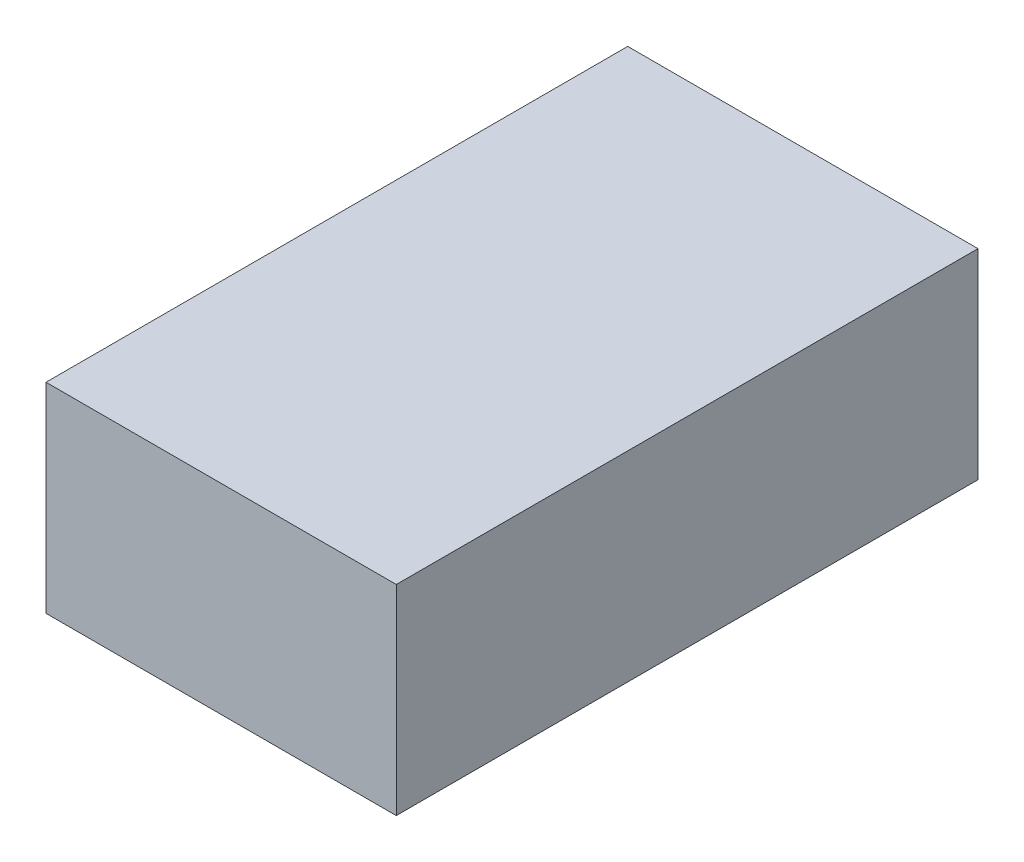
ISO-10303-21;
HEADER;
FILE_DESCRIPTION(('STEP AP214'),'2;1');
FILE_NAME('part.step','',(''),(''),'','','');
FILE_SCHEMA(('AUTOMOTIVE_DESIGN { 1 0 10303 214 1 1 1 1 }'));
ENDSEC;
DATA;
#1=APPLICATION_CONTEXT('core data for automotive mechanical design processes');
#2=APPLICATION_PROTOCOL_DEFINITION('international standard','automotive_design',2000,#1);
#3=PRODUCT_CONTEXT('',#1,'mechanical');
#4=PRODUCT('Part','Part','',(#3));
#5=PRODUCT_RELATED_PRODUCT_CATEGORY('part','',(#4));
#6=PRODUCT_DEFINITION_FORMATION('','',#4);
#7=PRODUCT_DEFINITION_CONTEXT('part definition',#1,'design');
#8=PRODUCT_DEFINITION('design','',#6,#7);
#9=PRODUCT_DEFINITION_SHAPE('','',#8);
#10=(LENGTH_UNIT() NAMED_UNIT(*) SI_UNIT(.MILLI.,.METRE.));
#11=(NAMED_UNIT(*) PLANE_ANGLE_UNIT() SI_UNIT($,.RADIAN.));
#12=(NAMED_UNIT(*) SI_UNIT($,.STERADIAN.) SOLID_ANGLE_UNIT());
#13=UNCERTAINTY_MEASURE_WITH_UNIT(LENGTH_MEASURE(1.E-05),#10,'distance_accuracy_value','');
#14=(GEOMETRIC_REPRESENTATION_CONTEXT(3) GLOBAL_UNCERTAINTY_ASSIGNED_CONTEXT((#13)) GLOBAL_UNIT_ASSIGNED_CONTEXT((#10,
#11,#12)) REPRESENTATION_CONTEXT('',''));
#15=CARTESIAN_POINT('',(0.,0.,0.));
#16=DIRECTION('',(0.,0.,1.));
#17=DIRECTION('',(1.,0.,0.));
#18=AXIS2_PLACEMENT_3D('',#15,#16,#17);
#19=CARTESIAN_POINT('',(-66.,78.,193.));
#20=DIRECTION('',(1.,0.,0.));
#21=DIRECTION('',(0.,0.,-1.));
#22=AXIS2_PLACEMENT_3D('',#19,#20,#21);
#23=PLANE('',#22);
#24=DIRECTION('',(0.,-1.,0.));
#25=VECTOR('',#24,1.);
#26=CARTESIAN_POINT('',(-66.,78.,100.));
#27=LINE('',#26,#25);
#28=CARTESIAN_POINT('',(-66.,78.,100.));
#29=VERTEX_POINT('',#28);
#30=CARTESIAN_POINT('',(-66.,46.,100.));
#31=VERTEX_POINT('',#30);
#32=EDGE_CURVE('E105',#29,#31,#27,.T.);
#33=ORIENTED_EDGE('',*,*,#32,.T.);
#34=DIRECTION('',(0.,0.,-1.));
#35=VECTOR('',#34,1.);
#36=CARTESIAN_POINT('',(-66.,46.,193.));
#37=LINE('',#36,#35);
#38=CARTESIAN_POINT('',(-66.,46.,193.));
#39=VERTEX_POINT('',#38);
#40=EDGE_CURVE('E11',#39,#31,#37,.T.);
#41=ORIENTED_EDGE('',*,*,#40,.F.);
#42=DIRECTION('',(0.,-1.,0.));
#43=VECTOR('',#42,1.);
#44=CARTESIAN_POINT('',(-66.,78.,193.));
#45=LINE('',#44,#43);
#46=CARTESIAN_POINT('',(-66.,78.,193.));
#47=VERTEX_POINT('',#46);
#48=EDGE_CURVE('E89',#47,#39,#45,.T.);
#49=ORIENTED_EDGE('',*,*,#48,.F.);
#50=DIRECTION('',(0.,0.,-1.));
#51=VECTOR('',#50,1.);
#52=CARTESIAN_POINT('',(-66.,78.,193.));
#53=LINE('',#52,#51);
#54=EDGE_CURVE('E97',#47,#29,#53,.T.);
#55=ORIENTED_EDGE('',*,*,#54,.T.);
#56=EDGE_LOOP('',(#33,#41,#49,#55));
#57=FACE_BOUND('',#56,.T.);
#58=ADVANCED_FACE('F39',(#57),#23,.F.);
#59=CARTESIAN_POINT('',(-66.,46.,193.));
#60=DIRECTION('',(0.,1.,0.));
#61=DIRECTION('',(0.,0.,1.));
#62=AXIS2_PLACEMENT_3D('',#59,#60,#61);
#63=PLANE('',#62);
#64=DIRECTION('',(1.,0.,0.));
#65=VECTOR('',#64,1.);
#66=CARTESIAN_POINT('',(-66.,46.,100.));
#67=LINE('',#66,#65);
#68=CARTESIAN_POINT('',(-10.,46.,100.));
#69=VERTEX_POINT('',#68);
#70=EDGE_CURVE('E92',#31,#69,#67,.T.);
#71=ORIENTED_EDGE('',*,*,#70,.T.);
#72=DIRECTION('',(0.,0.,-1.));
#73=VECTOR('',#72,1.);
#74=CARTESIAN_POINT('',(-10.,46.,193.));
#75=LINE('',#74,#73);
#76=CARTESIAN_POINT('',(-10.,46.,193.));
#77=VERTEX_POINT('',#76);
#78=EDGE_CURVE('E50',#77,#69,#75,.T.);
#79=ORIENTED_EDGE('',*,*,#78,.F.);
#80=DIRECTION('',(1.,0.,0.));
#81=VECTOR('',#80,1.);
#82=CARTESIAN_POINT('',(-66.,46.,193.));
#83=LINE('',#82,#81);
#84=EDGE_CURVE('E82',#39,#77,#83,.T.);
#85=ORIENTED_EDGE('',*,*,#84,.F.);
#86=ORIENTED_EDGE('',*,*,#40,.T.);
#87=EDGE_LOOP('',(#71,#79,#85,#86));
#88=FACE_BOUND('',#87,.T.);
#89=ADVANCED_FACE('F93',(#88),#63,.F.);
#90=CARTESIAN_POINT('',(-10.,46.,193.));
#91=DIRECTION('',(-1.,0.,0.));
#92=DIRECTION('',(0.,0.,1.));
#93=AXIS2_PLACEMENT_3D('',#90,#91,#92);
#94=PLANE('',#93);
#95=DIRECTION('',(0.,1.,0.));
#96=VECTOR('',#95,1.);
#97=CARTESIAN_POINT('',(-10.,46.,100.));
#98=LINE('',#97,#96);
#99=CARTESIAN_POINT('',(-10.,78.,100.));
#100=VERTEX_POINT('',#99);
#101=EDGE_CURVE('E74',#69,#100,#98,.T.);
#102=ORIENTED_EDGE('',*,*,#101,.T.);
#103=DIRECTION('',(0.,0.,-1.));
#104=VECTOR('',#103,1.);
#105=CARTESIAN_POINT('',(-10.,78.,193.));
#106=LINE('',#105,#104);
#107=CARTESIAN_POINT('',(-10.,78.,193.));
#108=VERTEX_POINT('',#107);
#109=EDGE_CURVE('E94',#108,#100,#106,.T.);
#110=ORIENTED_EDGE('',*,*,#109,.F.);
#111=DIRECTION('',(0.,1.,0.));
#112=VECTOR('',#111,1.);
#113=CARTESIAN_POINT('',(-10.,46.,193.));
#114=LINE('',#113,#112);
#115=EDGE_CURVE('E88',#77,#108,#114,.T.);
#116=ORIENTED_EDGE('',*,*,#115,.F.);
#117=ORIENTED_EDGE('',*,*,#78,.T.);
#118=EDGE_LOOP('',(#102,#110,#116,#117));
#119=FACE_BOUND('',#118,.T.);
#120=ADVANCED_FACE('F96',(#119),#94,.F.);
#121=CARTESIAN_POINT('',(-10.,78.,193.));
#122=DIRECTION('',(0.,-1.,0.));
#123=DIRECTION('',(0.,0.,-1.));
#124=AXIS2_PLACEMENT_3D('',#121,#122,#123);
#125=PLANE('',#124);
#126=DIRECTION('',(-1.,0.,0.));
#127=VECTOR('',#126,1.);
#128=CARTESIAN_POINT('',(-10.,78.,100.));
#129=LINE('',#128,#127);
#130=EDGE_CURVE('E76',#100,#29,#129,.T.);
#131=ORIENTED_EDGE('',*,*,#130,.T.);
#132=ORIENTED_EDGE('',*,*,#54,.F.);
#133=DIRECTION('',(-1.,0.,0.));
#134=VECTOR('',#133,1.);
#135=CARTESIAN_POINT('',(-10.,78.,193.));
#136=LINE('',#135,#134);
#137=EDGE_CURVE('E54',#108,#47,#136,.T.);
#138=ORIENTED_EDGE('',*,*,#137,.F.);
#139=ORIENTED_EDGE('',*,*,#109,.T.);
#140=EDGE_LOOP('',(#131,#132,#138,#139));
#141=FACE_BOUND('',#140,.T.);
#142=ADVANCED_FACE('F106',(#141),#125,.F.);
#143=CARTESIAN_POINT('',(0.,0.,193.));
#144=DIRECTION('',(0.,0.,1.));
#145=DIRECTION('',(1.,0.,0.));
#146=AXIS2_PLACEMENT_3D('',#143,#144,#145);
#147=PLANE('',#146);
#148=ORIENTED_EDGE('',*,*,#48,.T.);
#149=ORIENTED_EDGE('',*,*,#84,.T.);
#150=ORIENTED_EDGE('',*,*,#115,.T.);
#151=ORIENTED_EDGE('',*,*,#137,.T.);
#152=EDGE_LOOP('',(#148,#149,#150,#151));
#153=FACE_BOUND('',#152,.T.);
#154=ADVANCED_FACE('F86',(#153),#147,.T.);
#155=CARTESIAN_POINT('',(0.,0.,100.));
#156=DIRECTION('',(0.,0.,1.));
#157=DIRECTION('',(1.,0.,0.));
#158=AXIS2_PLACEMENT_3D('',#155,#156,#157);
#159=PLANE('',#158);
#160=ORIENTED_EDGE('',*,*,#32,.F.);
#161=ORIENTED_EDGE('',*,*,#130,.F.);
#162=ORIENTED_EDGE('',*,*,#101,.F.);
#163=ORIENTED_EDGE('',*,*,#70,.F.);
#164=EDGE_LOOP('',(#160,#161,#162,#163));
#165=FACE_BOUND('',#164,.T.);
#166=ADVANCED_FACE('F115',(#165),#159,.F.);
#167=CLOSED_SHELL('',(#58,#89,#120,#142,#154,#166));
#168=MANIFOLD_SOLID_BREP('B2',#167);
#169=ADVANCED_BREP_SHAPE_REPRESENTATION('',(#18,#168),#14);
#170=SHAPE_DEFINITION_REPRESENTATION(#9,#169);
ENDSEC;
END-ISO-10303-21;
